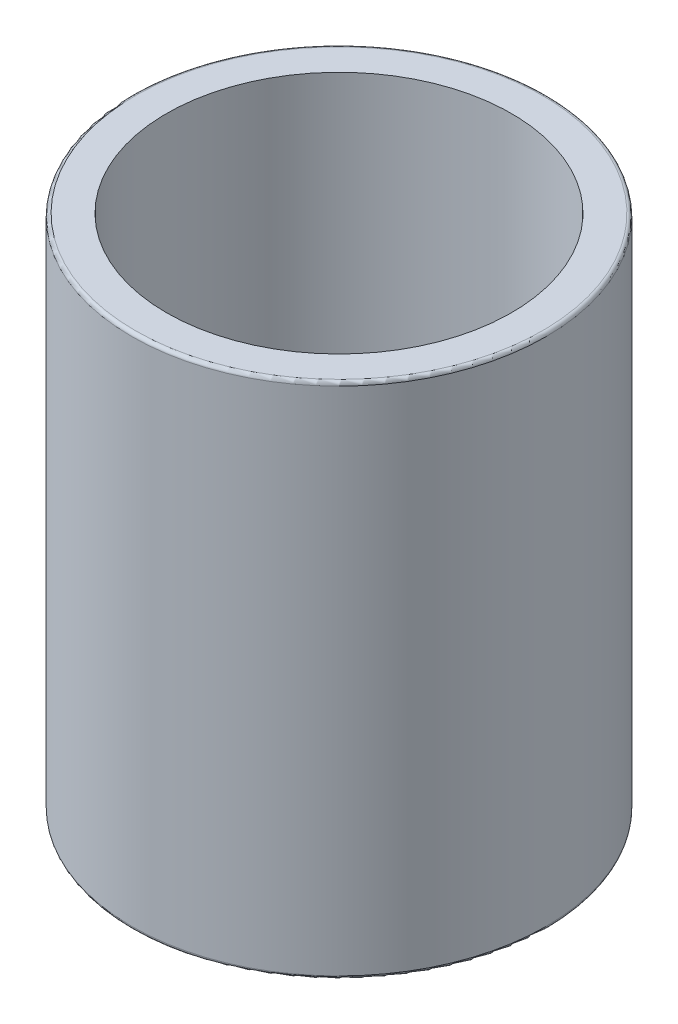
ISO-10303-21;
HEADER;
FILE_DESCRIPTION(('STEP AP214'),'2;1');
FILE_NAME('part.step','',(''),(''),'','','');
FILE_SCHEMA(('AUTOMOTIVE_DESIGN { 1 0 10303 214 1 1 1 1 }'));
ENDSEC;
DATA;
#1=APPLICATION_CONTEXT('core data for automotive mechanical design processes');
#2=APPLICATION_PROTOCOL_DEFINITION('international standard','automotive_design',2000,#1);
#3=PRODUCT_CONTEXT('',#1,'mechanical');
#4=PRODUCT('Part','Part','',(#3));
#5=PRODUCT_RELATED_PRODUCT_CATEGORY('part','',(#4));
#6=PRODUCT_DEFINITION_FORMATION('','',#4);
#7=PRODUCT_DEFINITION_CONTEXT('part definition',#1,'design');
#8=PRODUCT_DEFINITION('design','',#6,#7);
#9=PRODUCT_DEFINITION_SHAPE('','',#8);
#10=(LENGTH_UNIT() NAMED_UNIT(*) SI_UNIT(.MILLI.,.METRE.));
#11=(NAMED_UNIT(*) PLANE_ANGLE_UNIT() SI_UNIT($,.RADIAN.));
#12=(NAMED_UNIT(*) SI_UNIT($,.STERADIAN.) SOLID_ANGLE_UNIT());
#13=UNCERTAINTY_MEASURE_WITH_UNIT(LENGTH_MEASURE(1.E-05),#10,'distance_accuracy_value','');
#14=(GEOMETRIC_REPRESENTATION_CONTEXT(3) GLOBAL_UNCERTAINTY_ASSIGNED_CONTEXT((#13)) GLOBAL_UNIT_ASSIGNED_CONTEXT((#10,
#11,#12)) REPRESENTATION_CONTEXT('',''));
#15=CARTESIAN_POINT('',(0.,0.,0.));
#16=DIRECTION('',(0.,0.,1.));
#17=DIRECTION('',(1.,0.,0.));
#18=AXIS2_PLACEMENT_3D('',#15,#16,#17);
#19=CARTESIAN_POINT('',(0.,7.5,0.));
#20=DIRECTION('',(0.,1.,0.));
#21=DIRECTION('',(0.,0.,1.));
#22=AXIS2_PLACEMENT_3D('',#19,#20,#21);
#23=PLANE('',#22);
#24=CARTESIAN_POINT('',(0.,7.5,0.));
#25=DIRECTION('',(0.,1.,0.));
#26=DIRECTION('',(0.,0.,1.));
#27=AXIS2_PLACEMENT_3D('',#24,#25,#26);
#28=CIRCLE('',#27,5.9);
#29=CARTESIAN_POINT('',(0.,7.5,5.9));
#30=VERTEX_POINT('',#29);
#31=EDGE_CURVE('E10',#30,#30,#28,.T.);
#32=ORIENTED_EDGE('',*,*,#31,.T.);
#33=EDGE_LOOP('',(#32));
#34=FACE_BOUND('',#33,.T.);
#35=CARTESIAN_POINT('',(0.,7.5,0.));
#36=DIRECTION('',(0.,1.,0.));
#37=DIRECTION('',(0.,0.,1.));
#38=AXIS2_PLACEMENT_3D('',#35,#36,#37);
#39=CIRCLE('',#38,5.);
#40=CARTESIAN_POINT('',(0.,7.5,5.));
#41=VERTEX_POINT('',#40);
#42=EDGE_CURVE('E53',#41,#41,#39,.T.);
#43=ORIENTED_EDGE('',*,*,#42,.F.);
#44=EDGE_LOOP('',(#43));
#45=FACE_BOUND('',#44,.T.);
#46=ADVANCED_FACE('F33',(#34,#45),#23,.T.);
#47=CARTESIAN_POINT('',(0.,-7.5,0.));
#48=DIRECTION('',(0.,1.,0.));
#49=DIRECTION('',(0.,0.,1.));
#50=AXIS2_PLACEMENT_3D('',#47,#48,#49);
#51=PLANE('',#50);
#52=CARTESIAN_POINT('',(0.,-7.5,0.));
#53=DIRECTION('',(0.,1.,0.));
#54=DIRECTION('',(0.,0.,1.));
#55=AXIS2_PLACEMENT_3D('',#52,#53,#54);
#56=CIRCLE('',#55,5.9);
#57=CARTESIAN_POINT('',(0.,-7.5,5.9));
#58=VERTEX_POINT('',#57);
#59=EDGE_CURVE('E40',#58,#58,#56,.F.);
#60=ORIENTED_EDGE('',*,*,#59,.T.);
#61=EDGE_LOOP('',(#60));
#62=FACE_BOUND('',#61,.T.);
#63=CARTESIAN_POINT('',(0.,-7.5,0.));
#64=DIRECTION('',(0.,1.,0.));
#65=DIRECTION('',(0.,0.,1.));
#66=AXIS2_PLACEMENT_3D('',#63,#64,#65);
#67=CIRCLE('',#66,5.);
#68=CARTESIAN_POINT('',(0.,-7.5,5.));
#69=VERTEX_POINT('',#68);
#70=EDGE_CURVE('E54',#69,#69,#67,.T.);
#71=ORIENTED_EDGE('',*,*,#70,.T.);
#72=EDGE_LOOP('',(#71));
#73=FACE_BOUND('',#72,.T.);
#74=ADVANCED_FACE('F64',(#62,#73),#51,.F.);
#75=CARTESIAN_POINT('',(0.,7.5,0.));
#76=DIRECTION('',(0.,-1.,0.));
#77=DIRECTION('',(0.,0.,-1.));
#78=AXIS2_PLACEMENT_3D('',#75,#76,#77);
#79=CYLINDRICAL_SURFACE('',#78,6.);
#80=CARTESIAN_POINT('',(0.,-7.4,0.));
#81=DIRECTION('',(0.,1.,0.));
#82=DIRECTION('',(0.,0.,1.));
#83=AXIS2_PLACEMENT_3D('',#80,#81,#82);
#84=CIRCLE('',#83,6.);
#85=CARTESIAN_POINT('',(0.,-7.4,6.));
#86=VERTEX_POINT('',#85);
#87=EDGE_CURVE('E44',#86,#86,#84,.T.);
#88=ORIENTED_EDGE('',*,*,#87,.T.);
#89=EDGE_LOOP('',(#88));
#90=FACE_BOUND('',#89,.T.);
#91=CARTESIAN_POINT('',(0.,7.4,0.));
#92=DIRECTION('',(0.,1.,0.));
#93=DIRECTION('',(0.,0.,1.));
#94=AXIS2_PLACEMENT_3D('',#91,#92,#93);
#95=CIRCLE('',#94,6.);
#96=CARTESIAN_POINT('',(0.,7.4,6.));
#97=VERTEX_POINT('',#96);
#98=EDGE_CURVE('E48',#97,#97,#95,.F.);
#99=ORIENTED_EDGE('',*,*,#98,.T.);
#100=EDGE_LOOP('',(#99));
#101=FACE_BOUND('',#100,.T.);
#102=ADVANCED_FACE('F69',(#90,#101),#79,.T.);
#103=CARTESIAN_POINT('',(0.,7.5,0.));
#104=DIRECTION('',(0.,-1.,0.));
#105=DIRECTION('',(0.,0.,-1.));
#106=AXIS2_PLACEMENT_3D('',#103,#104,#105);
#107=CYLINDRICAL_SURFACE('',#106,5.);
#108=ORIENTED_EDGE('',*,*,#42,.T.);
#109=EDGE_LOOP('',(#108));
#110=FACE_BOUND('',#109,.T.);
#111=ORIENTED_EDGE('',*,*,#70,.F.);
#112=EDGE_LOOP('',(#111));
#113=FACE_BOUND('',#112,.T.);
#114=ADVANCED_FACE('F60',(#110,#113),#107,.F.);
#115=CARTESIAN_POINT('',(0.,-7.4,0.));
#116=DIRECTION('',(0.,1.,0.));
#117=DIRECTION('',(0.,0.,1.));
#118=AXIS2_PLACEMENT_3D('',#115,#116,#117);
#119=TOROIDAL_SURFACE('',#118,5.9,0.1);
#120=ORIENTED_EDGE('',*,*,#59,.F.);
#121=EDGE_LOOP('',(#120));
#122=FACE_BOUND('',#121,.T.);
#123=ORIENTED_EDGE('',*,*,#87,.F.);
#124=EDGE_LOOP('',(#123));
#125=FACE_BOUND('',#124,.T.);
#126=ADVANCED_FACE('F75',(#122,#125),#119,.T.);
#127=CARTESIAN_POINT('',(0.,7.4,0.));
#128=DIRECTION('',(0.,1.,0.));
#129=DIRECTION('',(0.,0.,1.));
#130=AXIS2_PLACEMENT_3D('',#127,#128,#129);
#131=TOROIDAL_SURFACE('',#130,5.9,0.1);
#132=ORIENTED_EDGE('',*,*,#98,.F.);
#133=EDGE_LOOP('',(#132));
#134=FACE_BOUND('',#133,.T.);
#135=ORIENTED_EDGE('',*,*,#31,.F.);
#136=EDGE_LOOP('',(#135));
#137=FACE_BOUND('',#136,.T.);
#138=ADVANCED_FACE('F35',(#134,#137),#131,.T.);
#139=CLOSED_SHELL('',(#46,#74,#102,#114,#126,#138));
#140=MANIFOLD_SOLID_BREP('B2',#139);
#141=ADVANCED_BREP_SHAPE_REPRESENTATION('',(#18,#140),#14);
#142=SHAPE_DEFINITION_REPRESENTATION(#9,#141);
ENDSEC;
END-ISO-10303-21;
